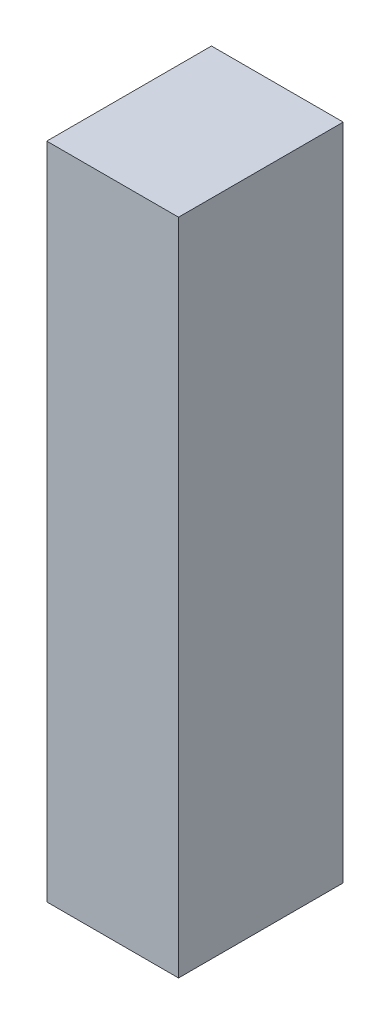
ISO-10303-21;
HEADER;
FILE_DESCRIPTION(('STEP AP214'),'2;1');
FILE_NAME('part.step','',(''),(''),'','','');
FILE_SCHEMA(('AUTOMOTIVE_DESIGN { 1 0 10303 214 1 1 1 1 }'));
ENDSEC;
DATA;
#1=APPLICATION_CONTEXT('core data for automotive mechanical design processes');
#2=APPLICATION_PROTOCOL_DEFINITION('international standard','automotive_design',2000,#1);
#3=PRODUCT_CONTEXT('',#1,'mechanical');
#4=PRODUCT('Part','Part','',(#3));
#5=PRODUCT_RELATED_PRODUCT_CATEGORY('part','',(#4));
#6=PRODUCT_DEFINITION_FORMATION('','',#4);
#7=PRODUCT_DEFINITION_CONTEXT('part definition',#1,'design');
#8=PRODUCT_DEFINITION('design','',#6,#7);
#9=PRODUCT_DEFINITION_SHAPE('','',#8);
#10=(LENGTH_UNIT() NAMED_UNIT(*) SI_UNIT(.MILLI.,.METRE.));
#11=(NAMED_UNIT(*) PLANE_ANGLE_UNIT() SI_UNIT($,.RADIAN.));
#12=(NAMED_UNIT(*) SI_UNIT($,.STERADIAN.) SOLID_ANGLE_UNIT());
#13=UNCERTAINTY_MEASURE_WITH_UNIT(LENGTH_MEASURE(1.E-05),#10,'distance_accuracy_value','');
#14=(GEOMETRIC_REPRESENTATION_CONTEXT(3) GLOBAL_UNCERTAINTY_ASSIGNED_CONTEXT((#13)) GLOBAL_UNIT_ASSIGNED_CONTEXT((#10,
#11,#12)) REPRESENTATION_CONTEXT('',''));
#15=CARTESIAN_POINT('',(0.,0.,0.));
#16=DIRECTION('',(0.,0.,1.));
#17=DIRECTION('',(1.,0.,0.));
#18=AXIS2_PLACEMENT_3D('',#15,#16,#17);
#19=CARTESIAN_POINT('',(1.5,-27.5,-1.875));
#20=DIRECTION('',(1.,0.,0.));
#21=DIRECTION('',(0.,0.,-1.));
#22=AXIS2_PLACEMENT_3D('',#19,#20,#21);
#23=PLANE('',#22);
#24=DIRECTION('',(0.,1.,0.));
#25=VECTOR('',#24,1.);
#26=CARTESIAN_POINT('',(1.5,-27.5,-1.875));
#27=LINE('',#26,#25);
#28=CARTESIAN_POINT('',(1.5,-27.5,-1.875));
#29=VERTEX_POINT('',#28);
#30=CARTESIAN_POINT('',(1.5,-12.5,-1.875));
#31=VERTEX_POINT('',#30);
#32=EDGE_CURVE('E41',#29,#31,#27,.T.);
#33=ORIENTED_EDGE('',*,*,#32,.T.);
#34=DIRECTION('',(0.,0.,-1.));
#35=VECTOR('',#34,1.);
#36=CARTESIAN_POINT('',(1.5,-12.5,-1.875));
#37=LINE('',#36,#35);
#38=CARTESIAN_POINT('',(1.5,-12.5,1.875));
#39=VERTEX_POINT('',#38);
#40=EDGE_CURVE('E79',#39,#31,#37,.T.);
#41=ORIENTED_EDGE('',*,*,#40,.F.);
#42=DIRECTION('',(0.,1.,0.));
#43=VECTOR('',#42,1.);
#44=CARTESIAN_POINT('',(1.5,-27.5,1.875));
#45=LINE('',#44,#43);
#46=CARTESIAN_POINT('',(1.5,-27.5,1.875));
#47=VERTEX_POINT('',#46);
#48=EDGE_CURVE('E11',#47,#39,#45,.T.);
#49=ORIENTED_EDGE('',*,*,#48,.F.);
#50=DIRECTION('',(0.,0.,-1.));
#51=VECTOR('',#50,1.);
#52=CARTESIAN_POINT('',(1.5,-27.5,-1.875));
#53=LINE('',#52,#51);
#54=EDGE_CURVE('E80',#47,#29,#53,.T.);
#55=ORIENTED_EDGE('',*,*,#54,.T.);
#56=EDGE_LOOP('',(#33,#41,#49,#55));
#57=FACE_BOUND('',#56,.T.);
#58=ADVANCED_FACE('F38',(#57),#23,.T.);
#59=CARTESIAN_POINT('',(-1.5,-27.5,1.875));
#60=DIRECTION('',(0.,0.,1.));
#61=DIRECTION('',(1.,0.,0.));
#62=AXIS2_PLACEMENT_3D('',#59,#60,#61);
#63=PLANE('',#62);
#64=ORIENTED_EDGE('',*,*,#48,.T.);
#65=DIRECTION('',(1.,0.,0.));
#66=VECTOR('',#65,1.);
#67=CARTESIAN_POINT('',(-1.5,-12.5,1.875));
#68=LINE('',#67,#66);
#69=CARTESIAN_POINT('',(-1.5,-12.5,1.875));
#70=VERTEX_POINT('',#69);
#71=EDGE_CURVE('E98',#70,#39,#68,.T.);
#72=ORIENTED_EDGE('',*,*,#71,.F.);
#73=DIRECTION('',(0.,1.,0.));
#74=VECTOR('',#73,1.);
#75=CARTESIAN_POINT('',(-1.5,-27.5,1.875));
#76=LINE('',#75,#74);
#77=CARTESIAN_POINT('',(-1.5,-27.5,1.875));
#78=VERTEX_POINT('',#77);
#79=EDGE_CURVE('E47',#78,#70,#76,.T.);
#80=ORIENTED_EDGE('',*,*,#79,.F.);
#81=DIRECTION('',(1.,0.,0.));
#82=VECTOR('',#81,1.);
#83=CARTESIAN_POINT('',(-1.5,-27.5,1.875));
#84=LINE('',#83,#82);
#85=EDGE_CURVE('E86',#78,#47,#84,.T.);
#86=ORIENTED_EDGE('',*,*,#85,.T.);
#87=EDGE_LOOP('',(#64,#72,#80,#86));
#88=FACE_BOUND('',#87,.T.);
#89=ADVANCED_FACE('F122',(#88),#63,.T.);
#90=CARTESIAN_POINT('',(-1.5,-27.5,-1.875));
#91=DIRECTION('',(-1.,0.,0.));
#92=DIRECTION('',(0.,0.,1.));
#93=AXIS2_PLACEMENT_3D('',#90,#91,#92);
#94=PLANE('',#93);
#95=ORIENTED_EDGE('',*,*,#79,.T.);
#96=DIRECTION('',(0.,0.,1.));
#97=VECTOR('',#96,1.);
#98=CARTESIAN_POINT('',(-1.5,-12.5,-1.875));
#99=LINE('',#98,#97);
#100=CARTESIAN_POINT('',(-1.5,-12.5,-1.875));
#101=VERTEX_POINT('',#100);
#102=EDGE_CURVE('E94',#101,#70,#99,.T.);
#103=ORIENTED_EDGE('',*,*,#102,.F.);
#104=DIRECTION('',(0.,1.,0.));
#105=VECTOR('',#104,1.);
#106=CARTESIAN_POINT('',(-1.5,-27.5,-1.875));
#107=LINE('',#106,#105);
#108=CARTESIAN_POINT('',(-1.5,-27.5,-1.875));
#109=VERTEX_POINT('',#108);
#110=EDGE_CURVE('E85',#109,#101,#107,.T.);
#111=ORIENTED_EDGE('',*,*,#110,.F.);
#112=DIRECTION('',(0.,0.,1.));
#113=VECTOR('',#112,1.);
#114=CARTESIAN_POINT('',(-1.5,-27.5,-1.875));
#115=LINE('',#114,#113);
#116=EDGE_CURVE('E111',#109,#78,#115,.T.);
#117=ORIENTED_EDGE('',*,*,#116,.T.);
#118=EDGE_LOOP('',(#95,#103,#111,#117));
#119=FACE_BOUND('',#118,.T.);
#120=ADVANCED_FACE('F119',(#119),#94,.T.);
#121=CARTESIAN_POINT('',(-1.5,-27.5,-1.875));
#122=DIRECTION('',(0.,0.,-1.));
#123=DIRECTION('',(-1.,0.,0.));
#124=AXIS2_PLACEMENT_3D('',#121,#122,#123);
#125=PLANE('',#124);
#126=ORIENTED_EDGE('',*,*,#110,.T.);
#127=DIRECTION('',(-1.,0.,0.));
#128=VECTOR('',#127,1.);
#129=CARTESIAN_POINT('',(-1.5,-12.5,-1.875));
#130=LINE('',#129,#128);
#131=EDGE_CURVE('E88',#31,#101,#130,.T.);
#132=ORIENTED_EDGE('',*,*,#131,.F.);
#133=ORIENTED_EDGE('',*,*,#32,.F.);
#134=DIRECTION('',(-1.,0.,0.));
#135=VECTOR('',#134,1.);
#136=CARTESIAN_POINT('',(-1.5,-27.5,-1.875));
#137=LINE('',#136,#135);
#138=EDGE_CURVE('E108',#29,#109,#137,.T.);
#139=ORIENTED_EDGE('',*,*,#138,.T.);
#140=EDGE_LOOP('',(#126,#132,#133,#139));
#141=FACE_BOUND('',#140,.T.);
#142=ADVANCED_FACE('F89',(#141),#125,.T.);
#143=CARTESIAN_POINT('',(0.,-27.5,0.));
#144=DIRECTION('',(0.,1.,0.));
#145=DIRECTION('',(0.,0.,1.));
#146=AXIS2_PLACEMENT_3D('',#143,#144,#145);
#147=PLANE('',#146);
#148=ORIENTED_EDGE('',*,*,#54,.F.);
#149=ORIENTED_EDGE('',*,*,#85,.F.);
#150=ORIENTED_EDGE('',*,*,#116,.F.);
#151=ORIENTED_EDGE('',*,*,#138,.F.);
#152=EDGE_LOOP('',(#148,#149,#150,#151));
#153=FACE_BOUND('',#152,.T.);
#154=ADVANCED_FACE('F124',(#153),#147,.F.);
#155=CARTESIAN_POINT('',(0.,-12.5,0.));
#156=DIRECTION('',(0.,1.,0.));
#157=DIRECTION('',(0.,0.,1.));
#158=AXIS2_PLACEMENT_3D('',#155,#156,#157);
#159=PLANE('',#158);
#160=ORIENTED_EDGE('',*,*,#40,.T.);
#161=ORIENTED_EDGE('',*,*,#131,.T.);
#162=ORIENTED_EDGE('',*,*,#102,.T.);
#163=ORIENTED_EDGE('',*,*,#71,.T.);
#164=EDGE_LOOP('',(#160,#161,#162,#163));
#165=FACE_BOUND('',#164,.T.);
#166=ADVANCED_FACE('F97',(#165),#159,.T.);
#167=CLOSED_SHELL('',(#58,#89,#120,#142,#154,#166));
#168=MANIFOLD_SOLID_BREP('B2',#167);
#169=ADVANCED_BREP_SHAPE_REPRESENTATION('',(#18,#168),#14);
#170=SHAPE_DEFINITION_REPRESENTATION(#9,#169);
ENDSEC;
END-ISO-10303-21;
